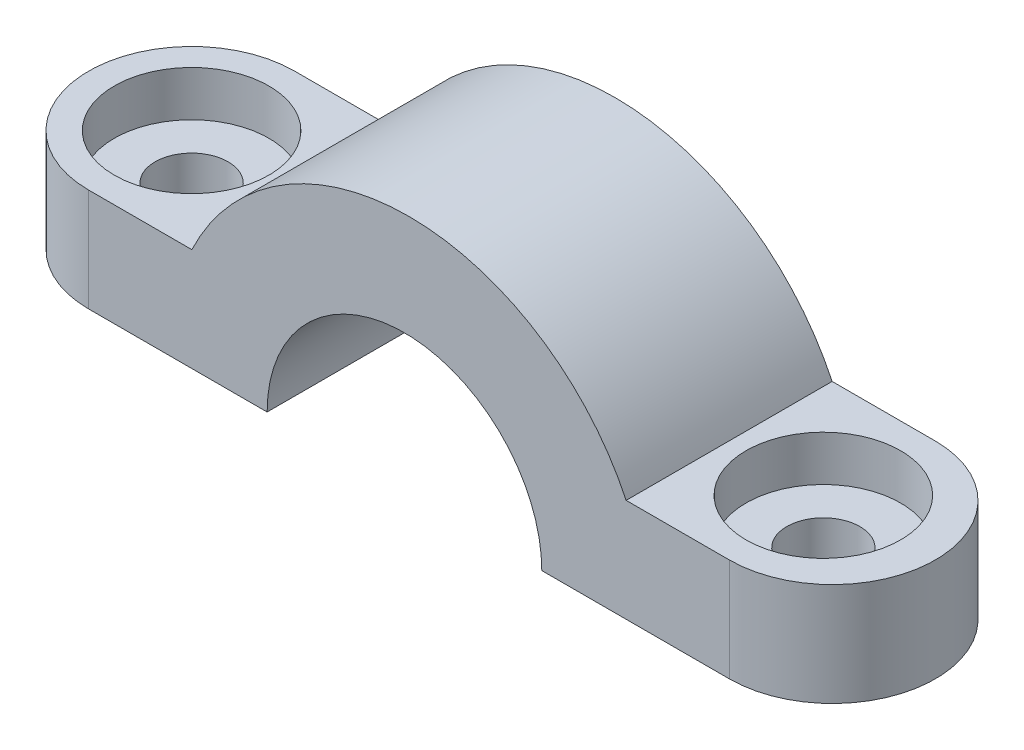
ISO-10303-21;
HEADER;
FILE_DESCRIPTION(('STEP AP214'),'2;1');
FILE_NAME('part.step','',(''),(''),'','','');
FILE_SCHEMA(('AUTOMOTIVE_DESIGN { 1 0 10303 214 1 1 1 1 }'));
ENDSEC;
DATA;
#1=APPLICATION_CONTEXT('core data for automotive mechanical design processes');
#2=APPLICATION_PROTOCOL_DEFINITION('international standard','automotive_design',2000,#1);
#3=PRODUCT_CONTEXT('',#1,'mechanical');
#4=PRODUCT('Part','Part','',(#3));
#5=PRODUCT_RELATED_PRODUCT_CATEGORY('part','',(#4));
#6=PRODUCT_DEFINITION_FORMATION('','',#4);
#7=PRODUCT_DEFINITION_CONTEXT('part definition',#1,'design');
#8=PRODUCT_DEFINITION('design','',#6,#7);
#9=PRODUCT_DEFINITION_SHAPE('','',#8);
#10=(LENGTH_UNIT() NAMED_UNIT(*) SI_UNIT(.MILLI.,.METRE.));
#11=(NAMED_UNIT(*) PLANE_ANGLE_UNIT() SI_UNIT($,.RADIAN.));
#12=(NAMED_UNIT(*) SI_UNIT($,.STERADIAN.) SOLID_ANGLE_UNIT());
#13=UNCERTAINTY_MEASURE_WITH_UNIT(LENGTH_MEASURE(1.E-05),#10,'distance_accuracy_value','');
#14=(GEOMETRIC_REPRESENTATION_CONTEXT(3) GLOBAL_UNCERTAINTY_ASSIGNED_CONTEXT((#13)) GLOBAL_UNIT_ASSIGNED_CONTEXT((#10,
#11,#12)) REPRESENTATION_CONTEXT('',''));
#15=CARTESIAN_POINT('',(0.,0.,0.));
#16=DIRECTION('',(0.,0.,1.));
#17=DIRECTION('',(1.,0.,0.));
#18=AXIS2_PLACEMENT_3D('',#15,#16,#17);
#19=CARTESIAN_POINT('',(-29.21,0.,0.));
#20=DIRECTION('',(0.,1.,0.));
#21=DIRECTION('',(0.,0.,1.));
#22=AXIS2_PLACEMENT_3D('',#19,#20,#21);
#23=PLANE('',#22);
#24=CARTESIAN_POINT('',(-29.21,0.,0.));
#25=DIRECTION('',(0.,1.,0.));
#26=DIRECTION('',(0.,0.,1.));
#27=AXIS2_PLACEMENT_3D('',#24,#25,#26);
#28=CIRCLE('',#27,3.3782);
#29=CARTESIAN_POINT('',(-29.21,0.,3.3782));
#30=VERTEX_POINT('',#29);
#31=EDGE_CURVE('E226',#30,#30,#28,.T.);
#32=ORIENTED_EDGE('',*,*,#31,.T.);
#33=EDGE_LOOP('',(#32));
#34=FACE_BOUND('',#33,.T.);
#35=DIRECTION('',(-1.,0.,0.));
#36=VECTOR('',#35,1.);
#37=CARTESIAN_POINT('',(-29.21,0.,-9.525));
#38=LINE('',#37,#36);
#39=CARTESIAN_POINT('',(-12.7,0.,-9.525));
#40=VERTEX_POINT('',#39);
#41=CARTESIAN_POINT('',(-29.21,0.,-9.525));
#42=VERTEX_POINT('',#41);
#43=EDGE_CURVE('E130',#40,#42,#38,.T.);
#44=ORIENTED_EDGE('',*,*,#43,.F.);
#45=DIRECTION('',(0.,0.,1.));
#46=VECTOR('',#45,1.);
#47=CARTESIAN_POINT('',(-12.7,0.,-9.525));
#48=LINE('',#47,#46);
#49=CARTESIAN_POINT('',(-12.7,0.,9.525));
#50=VERTEX_POINT('',#49);
#51=EDGE_CURVE('E11',#40,#50,#48,.T.);
#52=ORIENTED_EDGE('',*,*,#51,.T.);
#53=DIRECTION('',(1.,0.,0.));
#54=VECTOR('',#53,1.);
#55=CARTESIAN_POINT('',(-29.21,0.,9.525));
#56=LINE('',#55,#54);
#57=CARTESIAN_POINT('',(-29.21,0.,9.525));
#58=VERTEX_POINT('',#57);
#59=EDGE_CURVE('E116',#58,#50,#56,.T.);
#60=ORIENTED_EDGE('',*,*,#59,.F.);
#61=CARTESIAN_POINT('',(-29.21,0.,0.));
#62=DIRECTION('',(0.,1.,0.));
#63=DIRECTION('',(0.,0.,1.));
#64=AXIS2_PLACEMENT_3D('',#61,#62,#63);
#65=CIRCLE('',#64,9.525);
#66=EDGE_CURVE('E122',#42,#58,#65,.T.);
#67=ORIENTED_EDGE('',*,*,#66,.F.);
#68=EDGE_LOOP('',(#44,#52,#60,#67));
#69=FACE_BOUND('',#68,.T.);
#70=ADVANCED_FACE('F39',(#34,#69),#23,.F.);
#71=CARTESIAN_POINT('',(-29.21,9.525,0.));
#72=DIRECTION('',(0.,1.,0.));
#73=DIRECTION('',(0.,0.,1.));
#74=AXIS2_PLACEMENT_3D('',#71,#72,#73);
#75=PLANE('',#74);
#76=CARTESIAN_POINT('',(-29.21,9.525,0.));
#77=DIRECTION('',(0.,1.,0.));
#78=DIRECTION('',(0.,0.,1.));
#79=AXIS2_PLACEMENT_3D('',#76,#77,#78);
#80=CIRCLE('',#79,7.1501);
#81=CARTESIAN_POINT('',(-29.21,9.525,7.1501));
#82=VERTEX_POINT('',#81);
#83=EDGE_CURVE('E159',#82,#82,#80,.T.);
#84=ORIENTED_EDGE('',*,*,#83,.F.);
#85=EDGE_LOOP('',(#84));
#86=FACE_BOUND('',#85,.T.);
#87=DIRECTION('',(0.,0.,1.));
#88=VECTOR('',#87,1.);
#89=CARTESIAN_POINT('',(-19.6614940699042,9.525,-59.2216107999328));
#90=LINE('',#89,#88);
#91=CARTESIAN_POINT('',(-19.6614940699042,9.525,-9.525));
#92=VERTEX_POINT('',#91);
#93=CARTESIAN_POINT('',(-19.6614940699042,9.525,9.525));
#94=VERTEX_POINT('',#93);
#95=EDGE_CURVE('E125',#92,#94,#90,.T.);
#96=ORIENTED_EDGE('',*,*,#95,.F.);
#97=DIRECTION('',(-1.,0.,0.));
#98=VECTOR('',#97,1.);
#99=CARTESIAN_POINT('',(-29.21,9.525,-9.525));
#100=LINE('',#99,#98);
#101=CARTESIAN_POINT('',(-29.21,9.525,-9.525));
#102=VERTEX_POINT('',#101);
#103=EDGE_CURVE('E172',#92,#102,#100,.T.);
#104=ORIENTED_EDGE('',*,*,#103,.T.);
#105=CARTESIAN_POINT('',(-29.21,9.525,0.));
#106=DIRECTION('',(0.,1.,0.));
#107=DIRECTION('',(0.,0.,1.));
#108=AXIS2_PLACEMENT_3D('',#105,#106,#107);
#109=CIRCLE('',#108,9.525);
#110=CARTESIAN_POINT('',(-29.21,9.525,9.525));
#111=VERTEX_POINT('',#110);
#112=EDGE_CURVE('E133',#102,#111,#109,.T.);
#113=ORIENTED_EDGE('',*,*,#112,.T.);
#114=DIRECTION('',(1.,0.,0.));
#115=VECTOR('',#114,1.);
#116=CARTESIAN_POINT('',(-29.21,9.525,9.525));
#117=LINE('',#116,#115);
#118=EDGE_CURVE('E144',#111,#94,#117,.T.);
#119=ORIENTED_EDGE('',*,*,#118,.T.);
#120=EDGE_LOOP('',(#96,#104,#113,#119));
#121=FACE_BOUND('',#120,.T.);
#122=ADVANCED_FACE('F175',(#86,#121),#75,.T.);
#123=CARTESIAN_POINT('',(-29.21,9.525,0.));
#124=DIRECTION('',(0.,-1.,0.));
#125=DIRECTION('',(0.,0.,-1.));
#126=AXIS2_PLACEMENT_3D('',#123,#124,#125);
#127=CYLINDRICAL_SURFACE('',#126,9.525);
#128=ORIENTED_EDGE('',*,*,#66,.T.);
#129=DIRECTION('',(0.,-1.,0.));
#130=VECTOR('',#129,1.);
#131=CARTESIAN_POINT('',(-29.21,9.525,9.525));
#132=LINE('',#131,#130);
#133=EDGE_CURVE('E108',#111,#58,#132,.T.);
#134=ORIENTED_EDGE('',*,*,#133,.F.);
#135=ORIENTED_EDGE('',*,*,#112,.F.);
#136=DIRECTION('',(0.,-1.,0.));
#137=VECTOR('',#136,1.);
#138=CARTESIAN_POINT('',(-29.21,9.525,-9.525));
#139=LINE('',#138,#137);
#140=EDGE_CURVE('E134',#102,#42,#139,.T.);
#141=ORIENTED_EDGE('',*,*,#140,.T.);
#142=EDGE_LOOP('',(#128,#134,#135,#141));
#143=FACE_BOUND('',#142,.T.);
#144=ADVANCED_FACE('F41',(#143),#127,.T.);
#145=CARTESIAN_POINT('',(-29.21,9.525,9.525));
#146=DIRECTION('',(0.,0.,-1.));
#147=DIRECTION('',(-1.,0.,0.));
#148=AXIS2_PLACEMENT_3D('',#145,#146,#147);
#149=PLANE('',#148);
#150=ORIENTED_EDGE('',*,*,#59,.T.);
#151=CARTESIAN_POINT('',(0.,0.,9.525));
#152=DIRECTION('',(0.,0.,1.));
#153=DIRECTION('',(1.,0.,0.));
#154=AXIS2_PLACEMENT_3D('',#151,#152,#153);
#155=CIRCLE('',#154,12.7);
#156=CARTESIAN_POINT('',(12.7,0.,9.525));
#157=VERTEX_POINT('',#156);
#158=EDGE_CURVE('E103',#157,#50,#155,.T.);
#159=ORIENTED_EDGE('',*,*,#158,.F.);
#160=CARTESIAN_POINT('',(30.0479381443299,0.,9.525));
#161=VERTEX_POINT('',#160);
#162=EDGE_CURVE('E113',#157,#161,#56,.T.);
#163=ORIENTED_EDGE('',*,*,#162,.T.);
#164=DIRECTION('',(0.,-1.,0.));
#165=VECTOR('',#164,1.);
#166=CARTESIAN_POINT('',(30.0479381443299,9.525,9.525));
#167=LINE('',#166,#165);
#168=CARTESIAN_POINT('',(30.0479381443299,9.525,9.525));
#169=VERTEX_POINT('',#168);
#170=EDGE_CURVE('E140',#169,#161,#167,.T.);
#171=ORIENTED_EDGE('',*,*,#170,.F.);
#172=CARTESIAN_POINT('',(20.4994322142342,9.525,9.525));
#173=VERTEX_POINT('',#172);
#174=EDGE_CURVE('E169',#173,#169,#117,.T.);
#175=ORIENTED_EDGE('',*,*,#174,.F.);
#176=CARTESIAN_POINT('',(0.41896907216497,0.,9.525));
#177=DIRECTION('',(0.,0.,1.));
#178=DIRECTION('',(1.,0.,0.));
#179=AXIS2_PLACEMENT_3D('',#176,#177,#178);
#180=CIRCLE('',#179,22.225);
#181=EDGE_CURVE('E154',#173,#94,#180,.T.);
#182=ORIENTED_EDGE('',*,*,#181,.T.);
#183=ORIENTED_EDGE('',*,*,#118,.F.);
#184=ORIENTED_EDGE('',*,*,#133,.T.);
#185=EDGE_LOOP('',(#150,#159,#163,#171,#175,#182,#183,#184));
#186=FACE_BOUND('',#185,.T.);
#187=ADVANCED_FACE('F111',(#186),#149,.F.);
#188=CARTESIAN_POINT('',(30.0479381443299,9.525,0.));
#189=DIRECTION('',(0.,-1.,0.));
#190=DIRECTION('',(0.,0.,-1.));
#191=AXIS2_PLACEMENT_3D('',#188,#189,#190);
#192=CYLINDRICAL_SURFACE('',#191,9.525);
#193=CARTESIAN_POINT('',(30.0479381443299,0.,0.));
#194=DIRECTION('',(0.,1.,0.));
#195=DIRECTION('',(0.,0.,1.));
#196=AXIS2_PLACEMENT_3D('',#193,#194,#195);
#197=CIRCLE('',#196,9.525);
#198=CARTESIAN_POINT('',(30.0479381443299,0.,-9.525));
#199=VERTEX_POINT('',#198);
#200=EDGE_CURVE('E121',#161,#199,#197,.T.);
#201=ORIENTED_EDGE('',*,*,#200,.T.);
#202=DIRECTION('',(0.,-1.,0.));
#203=VECTOR('',#202,1.);
#204=CARTESIAN_POINT('',(30.0479381443299,9.525,-9.525));
#205=LINE('',#204,#203);
#206=CARTESIAN_POINT('',(30.0479381443299,9.525,-9.525));
#207=VERTEX_POINT('',#206);
#208=EDGE_CURVE('E137',#207,#199,#205,.T.);
#209=ORIENTED_EDGE('',*,*,#208,.F.);
#210=CARTESIAN_POINT('',(30.0479381443299,9.525,0.));
#211=DIRECTION('',(0.,1.,0.));
#212=DIRECTION('',(0.,0.,1.));
#213=AXIS2_PLACEMENT_3D('',#210,#211,#212);
#214=CIRCLE('',#213,9.525);
#215=EDGE_CURVE('E171',#169,#207,#214,.T.);
#216=ORIENTED_EDGE('',*,*,#215,.F.);
#217=ORIENTED_EDGE('',*,*,#170,.T.);
#218=EDGE_LOOP('',(#201,#209,#216,#217));
#219=FACE_BOUND('',#218,.T.);
#220=ADVANCED_FACE('F185',(#219),#192,.T.);
#221=CARTESIAN_POINT('',(-29.21,9.525,-9.525));
#222=DIRECTION('',(0.,0.,1.));
#223=DIRECTION('',(1.,0.,0.));
#224=AXIS2_PLACEMENT_3D('',#221,#222,#223);
#225=PLANE('',#224);
#226=CARTESIAN_POINT('',(12.7,0.,-9.525));
#227=VERTEX_POINT('',#226);
#228=EDGE_CURVE('E131',#199,#227,#38,.T.);
#229=ORIENTED_EDGE('',*,*,#228,.T.);
#230=CARTESIAN_POINT('',(0.,0.,-9.525));
#231=DIRECTION('',(0.,0.,1.));
#232=DIRECTION('',(1.,0.,0.));
#233=AXIS2_PLACEMENT_3D('',#230,#231,#232);
#234=CIRCLE('',#233,12.7);
#235=EDGE_CURVE('E54',#227,#40,#234,.T.);
#236=ORIENTED_EDGE('',*,*,#235,.T.);
#237=ORIENTED_EDGE('',*,*,#43,.T.);
#238=ORIENTED_EDGE('',*,*,#140,.F.);
#239=ORIENTED_EDGE('',*,*,#103,.F.);
#240=CARTESIAN_POINT('',(0.41896907216497,0.,-9.525));
#241=DIRECTION('',(0.,0.,1.));
#242=DIRECTION('',(1.,0.,0.));
#243=AXIS2_PLACEMENT_3D('',#240,#241,#242);
#244=CIRCLE('',#243,22.225);
#245=CARTESIAN_POINT('',(20.4994322142342,9.525,-9.525));
#246=VERTEX_POINT('',#245);
#247=EDGE_CURVE('E156',#92,#246,#244,.F.);
#248=ORIENTED_EDGE('',*,*,#247,.T.);
#249=EDGE_CURVE('E62',#207,#246,#100,.T.);
#250=ORIENTED_EDGE('',*,*,#249,.F.);
#251=ORIENTED_EDGE('',*,*,#208,.T.);
#252=EDGE_LOOP('',(#229,#236,#237,#238,#239,#248,#250,#251));
#253=FACE_BOUND('',#252,.T.);
#254=ADVANCED_FACE('F153',(#253),#225,.F.);
#255=CARTESIAN_POINT('',(29.21,9.525,0.));
#256=DIRECTION('',(0.,-1.,0.));
#257=DIRECTION('',(0.,0.,1.));
#258=AXIS2_PLACEMENT_3D('',#255,#256,#257);
#259=CIRCLE('',#258,7.1501);
#260=CARTESIAN_POINT('',(29.21,9.525,7.1501));
#261=VERTEX_POINT('',#260);
#262=EDGE_CURVE('E214',#261,#261,#259,.T.);
#263=ORIENTED_EDGE('',*,*,#262,.T.);
#264=EDGE_LOOP('',(#263));
#265=FACE_BOUND('',#264,.T.);
#266=DIRECTION('',(0.,0.,1.));
#267=VECTOR('',#266,1.);
#268=CARTESIAN_POINT('',(20.4994322142342,9.525,-59.2216107999328));
#269=LINE('',#268,#267);
#270=EDGE_CURVE('E164',#173,#246,#269,.F.);
#271=ORIENTED_EDGE('',*,*,#270,.F.);
#272=ORIENTED_EDGE('',*,*,#174,.T.);
#273=ORIENTED_EDGE('',*,*,#215,.T.);
#274=ORIENTED_EDGE('',*,*,#249,.T.);
#275=EDGE_LOOP('',(#271,#272,#273,#274));
#276=FACE_BOUND('',#275,.T.);
#277=ADVANCED_FACE('F181',(#265,#276),#75,.T.);
#278=CARTESIAN_POINT('',(29.21,0.,0.));
#279=DIRECTION('',(0.,-1.,0.));
#280=DIRECTION('',(0.,0.,1.));
#281=AXIS2_PLACEMENT_3D('',#278,#279,#280);
#282=CIRCLE('',#281,3.3782);
#283=CARTESIAN_POINT('',(29.21,0.,3.3782));
#284=VERTEX_POINT('',#283);
#285=EDGE_CURVE('E212',#284,#284,#282,.T.);
#286=ORIENTED_EDGE('',*,*,#285,.F.);
#287=EDGE_LOOP('',(#286));
#288=FACE_BOUND('',#287,.T.);
#289=ORIENTED_EDGE('',*,*,#162,.F.);
#290=DIRECTION('',(0.,0.,1.));
#291=VECTOR('',#290,1.);
#292=CARTESIAN_POINT('',(12.7,0.,-9.525));
#293=LINE('',#292,#291);
#294=EDGE_CURVE('E47',#157,#227,#293,.F.);
#295=ORIENTED_EDGE('',*,*,#294,.T.);
#296=ORIENTED_EDGE('',*,*,#228,.F.);
#297=ORIENTED_EDGE('',*,*,#200,.F.);
#298=EDGE_LOOP('',(#289,#295,#296,#297));
#299=FACE_BOUND('',#298,.T.);
#300=ADVANCED_FACE('F120',(#288,#299),#23,.F.);
#301=CARTESIAN_POINT('',(0.41896907216497,0.,-59.2216107999328));
#302=DIRECTION('',(0.,0.,1.));
#303=DIRECTION('',(1.,0.,0.));
#304=AXIS2_PLACEMENT_3D('',#301,#302,#303);
#305=CYLINDRICAL_SURFACE('',#304,22.225);
#306=ORIENTED_EDGE('',*,*,#247,.F.);
#307=ORIENTED_EDGE('',*,*,#95,.T.);
#308=ORIENTED_EDGE('',*,*,#181,.F.);
#309=ORIENTED_EDGE('',*,*,#270,.T.);
#310=EDGE_LOOP('',(#306,#307,#308,#309));
#311=FACE_BOUND('',#310,.T.);
#312=ADVANCED_FACE('F178',(#311),#305,.T.);
#313=CARTESIAN_POINT('',(0.,0.,-9.525));
#314=DIRECTION('',(0.,0.,1.));
#315=DIRECTION('',(1.,0.,0.));
#316=AXIS2_PLACEMENT_3D('',#313,#314,#315);
#317=CYLINDRICAL_SURFACE('',#316,12.7);
#318=ORIENTED_EDGE('',*,*,#235,.F.);
#319=ORIENTED_EDGE('',*,*,#294,.F.);
#320=ORIENTED_EDGE('',*,*,#158,.T.);
#321=ORIENTED_EDGE('',*,*,#51,.F.);
#322=EDGE_LOOP('',(#318,#319,#320,#321));
#323=FACE_BOUND('',#322,.T.);
#324=ADVANCED_FACE('F102',(#323),#317,.F.);
#325=CARTESIAN_POINT('',(-29.21,5.334,0.));
#326=DIRECTION('',(0.,1.,0.));
#327=DIRECTION('',(0.,0.,1.));
#328=AXIS2_PLACEMENT_3D('',#325,#326,#327);
#329=CYLINDRICAL_SURFACE('',#328,7.1501);
#330=CARTESIAN_POINT('',(-29.21,5.334,0.));
#331=DIRECTION('',(0.,1.,0.));
#332=DIRECTION('',(0.,0.,1.));
#333=AXIS2_PLACEMENT_3D('',#330,#331,#332);
#334=CIRCLE('',#333,7.1501);
#335=CARTESIAN_POINT('',(-29.21,5.334,7.1501));
#336=VERTEX_POINT('',#335);
#337=EDGE_CURVE('E117',#336,#336,#334,.T.);
#338=ORIENTED_EDGE('',*,*,#337,.F.);
#339=EDGE_LOOP('',(#338));
#340=FACE_BOUND('',#339,.T.);
#341=ORIENTED_EDGE('',*,*,#83,.T.);
#342=EDGE_LOOP('',(#341));
#343=FACE_BOUND('',#342,.T.);
#344=ADVANCED_FACE('F235',(#340,#343),#329,.F.);
#345=CARTESIAN_POINT('',(-29.21,5.334,0.));
#346=DIRECTION('',(0.,1.,0.));
#347=DIRECTION('',(0.,0.,1.));
#348=AXIS2_PLACEMENT_3D('',#345,#346,#347);
#349=PLANE('',#348);
#350=CARTESIAN_POINT('',(-29.21,5.334,0.));
#351=DIRECTION('',(0.,1.,0.));
#352=DIRECTION('',(0.,0.,1.));
#353=AXIS2_PLACEMENT_3D('',#350,#351,#352);
#354=CIRCLE('',#353,3.3782);
#355=CARTESIAN_POINT('',(-29.21,5.334,3.3782));
#356=VERTEX_POINT('',#355);
#357=EDGE_CURVE('E224',#356,#356,#354,.T.);
#358=ORIENTED_EDGE('',*,*,#357,.F.);
#359=EDGE_LOOP('',(#358));
#360=FACE_BOUND('',#359,.T.);
#361=ORIENTED_EDGE('',*,*,#337,.T.);
#362=EDGE_LOOP('',(#361));
#363=FACE_BOUND('',#362,.T.);
#364=ADVANCED_FACE('F237',(#360,#363),#349,.T.);
#365=CARTESIAN_POINT('',(-29.21,0.,0.));
#366=DIRECTION('',(0.,1.,0.));
#367=DIRECTION('',(0.,0.,1.));
#368=AXIS2_PLACEMENT_3D('',#365,#366,#367);
#369=CYLINDRICAL_SURFACE('',#368,3.3782);
#370=ORIENTED_EDGE('',*,*,#31,.F.);
#371=EDGE_LOOP('',(#370));
#372=FACE_BOUND('',#371,.T.);
#373=ORIENTED_EDGE('',*,*,#357,.T.);
#374=EDGE_LOOP('',(#373));
#375=FACE_BOUND('',#374,.T.);
#376=ADVANCED_FACE('F244',(#372,#375),#369,.F.);
#377=CARTESIAN_POINT('',(29.21,5.334,0.));
#378=DIRECTION('',(0.,1.,0.));
#379=DIRECTION('',(0.,0.,1.));
#380=AXIS2_PLACEMENT_3D('',#377,#378,#379);
#381=CYLINDRICAL_SURFACE('',#380,7.1501);
#382=CARTESIAN_POINT('',(29.21,5.334,0.));
#383=DIRECTION('',(0.,-1.,0.));
#384=DIRECTION('',(0.,0.,1.));
#385=AXIS2_PLACEMENT_3D('',#382,#383,#384);
#386=CIRCLE('',#385,7.1501);
#387=CARTESIAN_POINT('',(29.21,5.334,7.1501));
#388=VERTEX_POINT('',#387);
#389=EDGE_CURVE('E218',#388,#388,#386,.T.);
#390=ORIENTED_EDGE('',*,*,#389,.T.);
#391=EDGE_LOOP('',(#390));
#392=FACE_BOUND('',#391,.T.);
#393=ORIENTED_EDGE('',*,*,#262,.F.);
#394=EDGE_LOOP('',(#393));
#395=FACE_BOUND('',#394,.T.);
#396=ADVANCED_FACE('F251',(#392,#395),#381,.F.);
#397=CARTESIAN_POINT('',(29.21,5.334,0.));
#398=DIRECTION('',(0.,1.,0.));
#399=DIRECTION('',(0.,0.,1.));
#400=AXIS2_PLACEMENT_3D('',#397,#398,#399);
#401=PLANE('',#400);
#402=CARTESIAN_POINT('',(29.21,5.334,0.));
#403=DIRECTION('',(0.,-1.,0.));
#404=DIRECTION('',(0.,0.,1.));
#405=AXIS2_PLACEMENT_3D('',#402,#403,#404);
#406=CIRCLE('',#405,3.3782);
#407=CARTESIAN_POINT('',(29.21,5.334,3.3782));
#408=VERTEX_POINT('',#407);
#409=EDGE_CURVE('E215',#408,#408,#406,.T.);
#410=ORIENTED_EDGE('',*,*,#409,.T.);
#411=EDGE_LOOP('',(#410));
#412=FACE_BOUND('',#411,.T.);
#413=ORIENTED_EDGE('',*,*,#389,.F.);
#414=EDGE_LOOP('',(#413));
#415=FACE_BOUND('',#414,.T.);
#416=ADVANCED_FACE('F255',(#412,#415),#401,.T.);
#417=CARTESIAN_POINT('',(29.21,0.,0.));
#418=DIRECTION('',(0.,1.,0.));
#419=DIRECTION('',(0.,0.,1.));
#420=AXIS2_PLACEMENT_3D('',#417,#418,#419);
#421=CYLINDRICAL_SURFACE('',#420,3.3782);
#422=ORIENTED_EDGE('',*,*,#285,.T.);
#423=EDGE_LOOP('',(#422));
#424=FACE_BOUND('',#423,.T.);
#425=ORIENTED_EDGE('',*,*,#409,.F.);
#426=EDGE_LOOP('',(#425));
#427=FACE_BOUND('',#426,.T.);
#428=ADVANCED_FACE('F259',(#424,#427),#421,.F.);
#429=CLOSED_SHELL('',(#70,#122,#144,#187,#220,#254,#277,#300,#312,#324,#344,#364,#376,#396,#416,#428));
#430=MANIFOLD_SOLID_BREP('B2',#429);
#431=ADVANCED_BREP_SHAPE_REPRESENTATION('',(#18,#430),#14);
#432=SHAPE_DEFINITION_REPRESENTATION(#9,#431);
ENDSEC;
END-ISO-10303-21;
